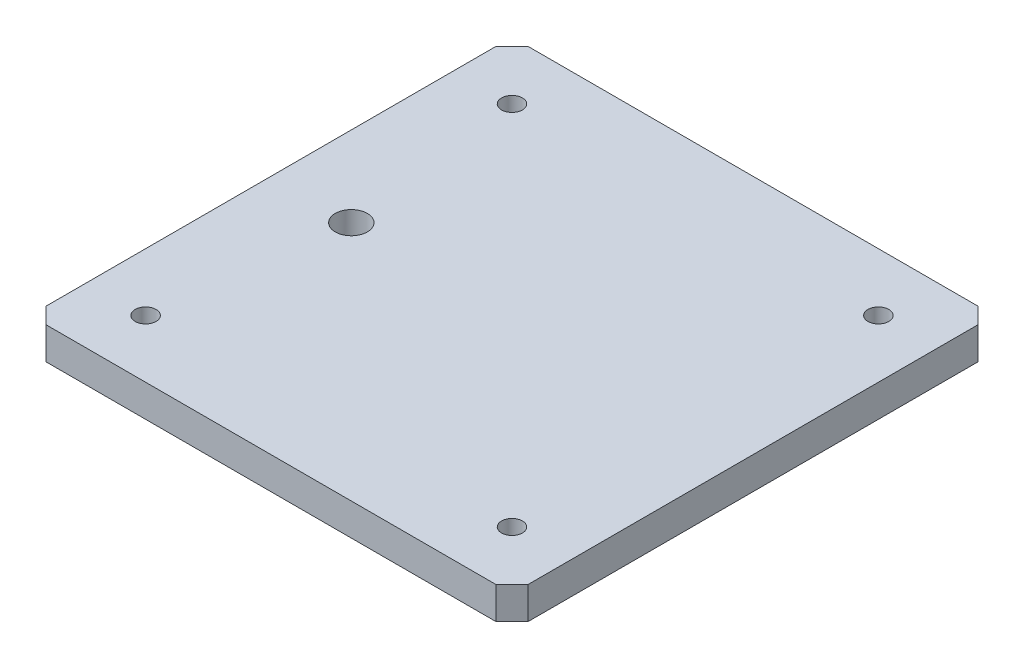
ISO-10303-21;
HEADER;
FILE_DESCRIPTION(('STEP AP214'),'2;1');
FILE_NAME('part.step','',(''),(''),'','','');
FILE_SCHEMA(('AUTOMOTIVE_DESIGN { 1 0 10303 214 1 1 1 1 }'));
ENDSEC;
DATA;
#1=APPLICATION_CONTEXT('core data for automotive mechanical design processes');
#2=APPLICATION_PROTOCOL_DEFINITION('international standard','automotive_design',2000,#1);
#3=PRODUCT_CONTEXT('',#1,'mechanical');
#4=PRODUCT('Part','Part','',(#3));
#5=PRODUCT_RELATED_PRODUCT_CATEGORY('part','',(#4));
#6=PRODUCT_DEFINITION_FORMATION('','',#4);
#7=PRODUCT_DEFINITION_CONTEXT('part definition',#1,'design');
#8=PRODUCT_DEFINITION('design','',#6,#7);
#9=PRODUCT_DEFINITION_SHAPE('','',#8);
#10=(LENGTH_UNIT() NAMED_UNIT(*) SI_UNIT(.MILLI.,.METRE.));
#11=(NAMED_UNIT(*) PLANE_ANGLE_UNIT() SI_UNIT($,.RADIAN.));
#12=(NAMED_UNIT(*) SI_UNIT($,.STERADIAN.) SOLID_ANGLE_UNIT());
#13=UNCERTAINTY_MEASURE_WITH_UNIT(LENGTH_MEASURE(1.E-05),#10,'distance_accuracy_value','');
#14=(GEOMETRIC_REPRESENTATION_CONTEXT(3) GLOBAL_UNCERTAINTY_ASSIGNED_CONTEXT((#13)) GLOBAL_UNIT_ASSIGNED_CONTEXT((#10,
#11,#12)) REPRESENTATION_CONTEXT('',''));
#15=CARTESIAN_POINT('',(0.,0.,0.));
#16=DIRECTION('',(0.,0.,1.));
#17=DIRECTION('',(1.,0.,0.));
#18=AXIS2_PLACEMENT_3D('',#15,#16,#17);
#19=CARTESIAN_POINT('',(-75.,10.,75.));
#20=DIRECTION('',(1.,0.,0.));
#21=DIRECTION('',(0.,0.,-1.));
#22=AXIS2_PLACEMENT_3D('',#19,#20,#21);
#23=PLANE('',#22);
#24=DIRECTION('',(0.,0.,1.));
#25=VECTOR('',#24,1.);
#26=CARTESIAN_POINT('',(-75.,10.,75.));
#27=LINE('',#26,#25);
#28=CARTESIAN_POINT('',(-75.,10.,-70.));
#29=VERTEX_POINT('',#28);
#30=CARTESIAN_POINT('',(-75.,10.,70.));
#31=VERTEX_POINT('',#30);
#32=EDGE_CURVE('E126',#29,#31,#27,.T.);
#33=ORIENTED_EDGE('',*,*,#32,.F.);
#34=DIRECTION('',(0.,-1.,0.));
#35=VECTOR('',#34,1.);
#36=CARTESIAN_POINT('',(-75.,10.,-70.));
#37=LINE('',#36,#35);
#38=CARTESIAN_POINT('',(-75.,0.,-70.));
#39=VERTEX_POINT('',#38);
#40=EDGE_CURVE('E11',#29,#39,#37,.T.);
#41=ORIENTED_EDGE('',*,*,#40,.T.);
#42=DIRECTION('',(0.,0.,1.));
#43=VECTOR('',#42,1.);
#44=CARTESIAN_POINT('',(-75.,0.,75.));
#45=LINE('',#44,#43);
#46=CARTESIAN_POINT('',(-75.,0.,70.));
#47=VERTEX_POINT('',#46);
#48=EDGE_CURVE('E158',#39,#47,#45,.T.);
#49=ORIENTED_EDGE('',*,*,#48,.T.);
#50=DIRECTION('',(0.,1.,0.));
#51=VECTOR('',#50,1.);
#52=CARTESIAN_POINT('',(-75.,10.,70.));
#53=LINE('',#52,#51);
#54=EDGE_CURVE('E40',#47,#31,#53,.T.);
#55=ORIENTED_EDGE('',*,*,#54,.T.);
#56=EDGE_LOOP('',(#33,#41,#49,#55));
#57=FACE_BOUND('',#56,.T.);
#58=ADVANCED_FACE('F31',(#57),#23,.F.);
#59=CARTESIAN_POINT('',(-75.,10.,75.));
#60=DIRECTION('',(0.,0.,-1.));
#61=DIRECTION('',(-1.,0.,0.));
#62=AXIS2_PLACEMENT_3D('',#59,#60,#61);
#63=PLANE('',#62);
#64=DIRECTION('',(1.,0.,0.));
#65=VECTOR('',#64,1.);
#66=CARTESIAN_POINT('',(-75.,0.,75.));
#67=LINE('',#66,#65);
#68=CARTESIAN_POINT('',(-70.,0.,75.));
#69=VERTEX_POINT('',#68);
#70=CARTESIAN_POINT('',(70.,0.,75.));
#71=VERTEX_POINT('',#70);
#72=EDGE_CURVE('E131',#69,#71,#67,.T.);
#73=ORIENTED_EDGE('',*,*,#72,.T.);
#74=DIRECTION('',(0.,1.,0.));
#75=VECTOR('',#74,1.);
#76=CARTESIAN_POINT('',(70.,10.,75.));
#77=LINE('',#76,#75);
#78=CARTESIAN_POINT('',(70.,10.,75.));
#79=VERTEX_POINT('',#78);
#80=EDGE_CURVE('E47',#71,#79,#77,.T.);
#81=ORIENTED_EDGE('',*,*,#80,.T.);
#82=DIRECTION('',(1.,0.,0.));
#83=VECTOR('',#82,1.);
#84=CARTESIAN_POINT('',(-75.,10.,75.));
#85=LINE('',#84,#83);
#86=CARTESIAN_POINT('',(-70.,10.,75.));
#87=VERTEX_POINT('',#86);
#88=EDGE_CURVE('E129',#87,#79,#85,.T.);
#89=ORIENTED_EDGE('',*,*,#88,.F.);
#90=DIRECTION('',(0.,-1.,0.));
#91=VECTOR('',#90,1.);
#92=CARTESIAN_POINT('',(-70.,10.,75.));
#93=LINE('',#92,#91);
#94=EDGE_CURVE('E149',#87,#69,#93,.T.);
#95=ORIENTED_EDGE('',*,*,#94,.T.);
#96=EDGE_LOOP('',(#73,#81,#89,#95));
#97=FACE_BOUND('',#96,.T.);
#98=ADVANCED_FACE('F165',(#97),#63,.F.);
#99=CARTESIAN_POINT('',(75.,10.,75.));
#100=DIRECTION('',(-1.,0.,0.));
#101=DIRECTION('',(0.,0.,1.));
#102=AXIS2_PLACEMENT_3D('',#99,#100,#101);
#103=PLANE('',#102);
#104=DIRECTION('',(0.,0.,-1.));
#105=VECTOR('',#104,1.);
#106=CARTESIAN_POINT('',(75.,0.,75.));
#107=LINE('',#106,#105);
#108=CARTESIAN_POINT('',(75.,0.,70.));
#109=VERTEX_POINT('',#108);
#110=CARTESIAN_POINT('',(75.,0.,-70.));
#111=VERTEX_POINT('',#110);
#112=EDGE_CURVE('E127',#109,#111,#107,.T.);
#113=ORIENTED_EDGE('',*,*,#112,.T.);
#114=DIRECTION('',(0.,1.,0.));
#115=VECTOR('',#114,1.);
#116=CARTESIAN_POINT('',(75.,10.,-70.));
#117=LINE('',#116,#115);
#118=CARTESIAN_POINT('',(75.,10.,-70.));
#119=VERTEX_POINT('',#118);
#120=EDGE_CURVE('E104',#111,#119,#117,.T.);
#121=ORIENTED_EDGE('',*,*,#120,.T.);
#122=DIRECTION('',(0.,0.,-1.));
#123=VECTOR('',#122,1.);
#124=CARTESIAN_POINT('',(75.,10.,75.));
#125=LINE('',#124,#123);
#126=CARTESIAN_POINT('',(75.,10.,70.));
#127=VERTEX_POINT('',#126);
#128=EDGE_CURVE('E170',#127,#119,#125,.T.);
#129=ORIENTED_EDGE('',*,*,#128,.F.);
#130=DIRECTION('',(0.,-1.,0.));
#131=VECTOR('',#130,1.);
#132=CARTESIAN_POINT('',(75.,10.,70.));
#133=LINE('',#132,#131);
#134=EDGE_CURVE('E109',#127,#109,#133,.T.);
#135=ORIENTED_EDGE('',*,*,#134,.T.);
#136=EDGE_LOOP('',(#113,#121,#129,#135));
#137=FACE_BOUND('',#136,.T.);
#138=ADVANCED_FACE('F229',(#137),#103,.F.);
#139=CARTESIAN_POINT('',(-75.,10.,-75.));
#140=DIRECTION('',(0.,0.,1.));
#141=DIRECTION('',(1.,0.,0.));
#142=AXIS2_PLACEMENT_3D('',#139,#140,#141);
#143=PLANE('',#142);
#144=DIRECTION('',(-1.,0.,0.));
#145=VECTOR('',#144,1.);
#146=CARTESIAN_POINT('',(-75.,10.,-75.));
#147=LINE('',#146,#145);
#148=CARTESIAN_POINT('',(70.,10.,-75.));
#149=VERTEX_POINT('',#148);
#150=CARTESIAN_POINT('',(-70.,10.,-75.));
#151=VERTEX_POINT('',#150);
#152=EDGE_CURVE('E119',#149,#151,#147,.T.);
#153=ORIENTED_EDGE('',*,*,#152,.F.);
#154=DIRECTION('',(0.,-1.,0.));
#155=VECTOR('',#154,1.);
#156=CARTESIAN_POINT('',(70.,10.,-75.));
#157=LINE('',#156,#155);
#158=CARTESIAN_POINT('',(70.,0.,-75.));
#159=VERTEX_POINT('',#158);
#160=EDGE_CURVE('E103',#149,#159,#157,.T.);
#161=ORIENTED_EDGE('',*,*,#160,.T.);
#162=DIRECTION('',(-1.,0.,0.));
#163=VECTOR('',#162,1.);
#164=CARTESIAN_POINT('',(-75.,0.,-75.));
#165=LINE('',#164,#163);
#166=CARTESIAN_POINT('',(-70.,0.,-75.));
#167=VERTEX_POINT('',#166);
#168=EDGE_CURVE('E116',#159,#167,#165,.T.);
#169=ORIENTED_EDGE('',*,*,#168,.T.);
#170=DIRECTION('',(0.,1.,0.));
#171=VECTOR('',#170,1.);
#172=CARTESIAN_POINT('',(-70.,10.,-75.));
#173=LINE('',#172,#171);
#174=EDGE_CURVE('E121',#167,#151,#173,.T.);
#175=ORIENTED_EDGE('',*,*,#174,.T.);
#176=EDGE_LOOP('',(#153,#161,#169,#175));
#177=FACE_BOUND('',#176,.T.);
#178=ADVANCED_FACE('F115',(#177),#143,.F.);
#179=CARTESIAN_POINT('',(-75.,10.,-75.));
#180=DIRECTION('',(0.,-1.,0.));
#181=DIRECTION('',(0.,0.,-1.));
#182=AXIS2_PLACEMENT_3D('',#179,#180,#181);
#183=PLANE('',#182);
#184=CARTESIAN_POINT('',(-50.,10.,0.));
#185=DIRECTION('',(0.,1.,0.));
#186=DIRECTION('',(0.,0.,1.));
#187=AXIS2_PLACEMENT_3D('',#184,#185,#186);
#188=CIRCLE('',#187,5.);
#189=CARTESIAN_POINT('',(-50.,10.,5.));
#190=VERTEX_POINT('',#189);
#191=EDGE_CURVE('E196',#190,#190,#188,.T.);
#192=ORIENTED_EDGE('',*,*,#191,.F.);
#193=EDGE_LOOP('',(#192));
#194=FACE_BOUND('',#193,.T.);
#195=CARTESIAN_POINT('',(-57.,10.,-57.));
#196=DIRECTION('',(0.,1.,0.));
#197=DIRECTION('',(0.,0.,1.));
#198=AXIS2_PLACEMENT_3D('',#195,#196,#197);
#199=CIRCLE('',#198,3.24999999999999);
#200=CARTESIAN_POINT('',(-57.,10.,-53.75));
#201=VERTEX_POINT('',#200);
#202=EDGE_CURVE('E193',#201,#201,#199,.T.);
#203=ORIENTED_EDGE('',*,*,#202,.F.);
#204=EDGE_LOOP('',(#203));
#205=FACE_BOUND('',#204,.T.);
#206=CARTESIAN_POINT('',(57.,10.,-57.));
#207=DIRECTION('',(0.,1.,0.));
#208=DIRECTION('',(0.,0.,1.));
#209=AXIS2_PLACEMENT_3D('',#206,#207,#208);
#210=CIRCLE('',#209,3.24999999999999);
#211=CARTESIAN_POINT('',(57.,10.,-53.75));
#212=VERTEX_POINT('',#211);
#213=EDGE_CURVE('E187',#212,#212,#210,.T.);
#214=ORIENTED_EDGE('',*,*,#213,.F.);
#215=EDGE_LOOP('',(#214));
#216=FACE_BOUND('',#215,.T.);
#217=CARTESIAN_POINT('',(-57.,10.,57.));
#218=DIRECTION('',(0.,1.,0.));
#219=DIRECTION('',(0.,0.,1.));
#220=AXIS2_PLACEMENT_3D('',#217,#218,#219);
#221=CIRCLE('',#220,3.24999999999999);
#222=CARTESIAN_POINT('',(-57.,10.,60.25));
#223=VERTEX_POINT('',#222);
#224=EDGE_CURVE('E181',#223,#223,#221,.T.);
#225=ORIENTED_EDGE('',*,*,#224,.F.);
#226=EDGE_LOOP('',(#225));
#227=FACE_BOUND('',#226,.T.);
#228=CARTESIAN_POINT('',(57.,10.,57.));
#229=DIRECTION('',(0.,1.,0.));
#230=DIRECTION('',(0.,0.,1.));
#231=AXIS2_PLACEMENT_3D('',#228,#229,#230);
#232=CIRCLE('',#231,3.24999999999999);
#233=CARTESIAN_POINT('',(57.,10.,60.25));
#234=VERTEX_POINT('',#233);
#235=EDGE_CURVE('E175',#234,#234,#232,.T.);
#236=ORIENTED_EDGE('',*,*,#235,.F.);
#237=EDGE_LOOP('',(#236));
#238=FACE_BOUND('',#237,.T.);
#239=ORIENTED_EDGE('',*,*,#128,.T.);
#240=DIRECTION('',(0.707106781186546,0.,0.707106781186549));
#241=VECTOR('',#240,1.);
#242=CARTESIAN_POINT('',(70.,10.,-75.));
#243=LINE('',#242,#241);
#244=EDGE_CURVE('E147',#119,#149,#243,.F.);
#245=ORIENTED_EDGE('',*,*,#244,.T.);
#246=ORIENTED_EDGE('',*,*,#152,.T.);
#247=DIRECTION('',(0.707106781186549,0.,-0.707106781186546));
#248=VECTOR('',#247,1.);
#249=CARTESIAN_POINT('',(-75.,10.,-70.));
#250=LINE('',#249,#248);
#251=EDGE_CURVE('E143',#151,#29,#250,.F.);
#252=ORIENTED_EDGE('',*,*,#251,.T.);
#253=ORIENTED_EDGE('',*,*,#32,.T.);
#254=DIRECTION('',(-0.707106781186546,0.,-0.707106781186549));
#255=VECTOR('',#254,1.);
#256=CARTESIAN_POINT('',(-70.,10.,75.));
#257=LINE('',#256,#255);
#258=EDGE_CURVE('E54',#31,#87,#257,.F.);
#259=ORIENTED_EDGE('',*,*,#258,.T.);
#260=ORIENTED_EDGE('',*,*,#88,.T.);
#261=DIRECTION('',(-0.707106781186549,0.,0.707106781186546));
#262=VECTOR('',#261,1.);
#263=CARTESIAN_POINT('',(75.,10.,70.));
#264=LINE('',#263,#262);
#265=EDGE_CURVE('E145',#79,#127,#264,.F.);
#266=ORIENTED_EDGE('',*,*,#265,.T.);
#267=EDGE_LOOP('',(#239,#245,#246,#252,#253,#259,#260,#266));
#268=FACE_BOUND('',#267,.T.);
#269=ADVANCED_FACE('F161',(#194,#205,#216,#227,#238,#268),#183,.F.);
#270=CARTESIAN_POINT('',(-75.,0.,-75.));
#271=DIRECTION('',(0.,-1.,0.));
#272=DIRECTION('',(0.,0.,-1.));
#273=AXIS2_PLACEMENT_3D('',#270,#271,#272);
#274=PLANE('',#273);
#275=CARTESIAN_POINT('',(-50.,0.,0.));
#276=DIRECTION('',(0.,-1.,0.));
#277=DIRECTION('',(0.,0.,-1.));
#278=AXIS2_PLACEMENT_3D('',#275,#276,#277);
#279=CIRCLE('',#278,5.);
#280=CARTESIAN_POINT('',(-50.,0.,-5.));
#281=VERTEX_POINT('',#280);
#282=EDGE_CURVE('E35',#281,#281,#279,.T.);
#283=ORIENTED_EDGE('',*,*,#282,.F.);
#284=EDGE_LOOP('',(#283));
#285=FACE_BOUND('',#284,.T.);
#286=CARTESIAN_POINT('',(-57.,0.,-57.));
#287=DIRECTION('',(0.,1.,0.));
#288=DIRECTION('',(0.,0.,1.));
#289=AXIS2_PLACEMENT_3D('',#286,#287,#288);
#290=CIRCLE('',#289,3.25);
#291=CARTESIAN_POINT('',(-57.,0.,-53.75));
#292=VERTEX_POINT('',#291);
#293=EDGE_CURVE('E190',#292,#292,#290,.T.);
#294=ORIENTED_EDGE('',*,*,#293,.T.);
#295=EDGE_LOOP('',(#294));
#296=FACE_BOUND('',#295,.T.);
#297=CARTESIAN_POINT('',(57.,0.,-57.));
#298=DIRECTION('',(0.,1.,0.));
#299=DIRECTION('',(0.,0.,1.));
#300=AXIS2_PLACEMENT_3D('',#297,#298,#299);
#301=CIRCLE('',#300,3.25);
#302=CARTESIAN_POINT('',(57.,0.,-53.75));
#303=VERTEX_POINT('',#302);
#304=EDGE_CURVE('E184',#303,#303,#301,.T.);
#305=ORIENTED_EDGE('',*,*,#304,.T.);
#306=EDGE_LOOP('',(#305));
#307=FACE_BOUND('',#306,.T.);
#308=CARTESIAN_POINT('',(-57.,0.,57.));
#309=DIRECTION('',(0.,1.,0.));
#310=DIRECTION('',(0.,0.,1.));
#311=AXIS2_PLACEMENT_3D('',#308,#309,#310);
#312=CIRCLE('',#311,3.25);
#313=CARTESIAN_POINT('',(-57.,0.,60.25));
#314=VERTEX_POINT('',#313);
#315=EDGE_CURVE('E178',#314,#314,#312,.T.);
#316=ORIENTED_EDGE('',*,*,#315,.T.);
#317=EDGE_LOOP('',(#316));
#318=FACE_BOUND('',#317,.T.);
#319=CARTESIAN_POINT('',(57.,0.,57.));
#320=DIRECTION('',(0.,1.,0.));
#321=DIRECTION('',(0.,0.,1.));
#322=AXIS2_PLACEMENT_3D('',#319,#320,#321);
#323=CIRCLE('',#322,3.25);
#324=CARTESIAN_POINT('',(57.,0.,60.25));
#325=VERTEX_POINT('',#324);
#326=EDGE_CURVE('E166',#325,#325,#323,.T.);
#327=ORIENTED_EDGE('',*,*,#326,.T.);
#328=EDGE_LOOP('',(#327));
#329=FACE_BOUND('',#328,.T.);
#330=ORIENTED_EDGE('',*,*,#168,.F.);
#331=DIRECTION('',(-0.707106781186546,0.,-0.707106781186549));
#332=VECTOR('',#331,1.);
#333=CARTESIAN_POINT('',(-2.4999999999996,0.,-147.5));
#334=LINE('',#333,#332);
#335=EDGE_CURVE('E99',#159,#111,#334,.F.);
#336=ORIENTED_EDGE('',*,*,#335,.T.);
#337=ORIENTED_EDGE('',*,*,#112,.F.);
#338=DIRECTION('',(0.707106781186549,0.,-0.707106781186546));
#339=VECTOR('',#338,1.);
#340=CARTESIAN_POINT('',(72.4999999999996,0.,72.5000000000004));
#341=LINE('',#340,#339);
#342=EDGE_CURVE('E110',#109,#71,#341,.F.);
#343=ORIENTED_EDGE('',*,*,#342,.T.);
#344=ORIENTED_EDGE('',*,*,#72,.F.);
#345=DIRECTION('',(0.707106781186546,0.,0.707106781186549));
#346=VECTOR('',#345,1.);
#347=CARTESIAN_POINT('',(-147.5,0.,-2.50000000000039));
#348=LINE('',#347,#346);
#349=EDGE_CURVE('E120',#69,#47,#348,.F.);
#350=ORIENTED_EDGE('',*,*,#349,.T.);
#351=ORIENTED_EDGE('',*,*,#48,.F.);
#352=DIRECTION('',(-0.707106781186549,0.,0.707106781186546));
#353=VECTOR('',#352,1.);
#354=CARTESIAN_POINT('',(-72.5,0.,-72.5));
#355=LINE('',#354,#353);
#356=EDGE_CURVE('E125',#39,#167,#355,.F.);
#357=ORIENTED_EDGE('',*,*,#356,.T.);
#358=EDGE_LOOP('',(#330,#336,#337,#343,#344,#350,#351,#357));
#359=FACE_BOUND('',#358,.T.);
#360=ADVANCED_FACE('F123',(#285,#296,#307,#318,#329,#359),#274,.T.);
#361=CARTESIAN_POINT('',(70.,10.,-75.));
#362=DIRECTION('',(-0.707106781186549,0.,0.707106781186545));
#363=DIRECTION('',(0.707106781186546,0.,0.707106781186549));
#364=AXIS2_PLACEMENT_3D('',#361,#362,#363);
#365=PLANE('',#364);
#366=ORIENTED_EDGE('',*,*,#244,.F.);
#367=ORIENTED_EDGE('',*,*,#120,.F.);
#368=ORIENTED_EDGE('',*,*,#335,.F.);
#369=ORIENTED_EDGE('',*,*,#160,.F.);
#370=EDGE_LOOP('',(#366,#367,#368,#369));
#371=FACE_BOUND('',#370,.T.);
#372=ADVANCED_FACE('F102',(#371),#365,.F.);
#373=CARTESIAN_POINT('',(75.,10.,70.));
#374=DIRECTION('',(-0.707106781186545,0.,-0.707106781186549));
#375=DIRECTION('',(-0.707106781186549,0.,0.707106781186546));
#376=AXIS2_PLACEMENT_3D('',#373,#374,#375);
#377=PLANE('',#376);
#378=ORIENTED_EDGE('',*,*,#265,.F.);
#379=ORIENTED_EDGE('',*,*,#80,.F.);
#380=ORIENTED_EDGE('',*,*,#342,.F.);
#381=ORIENTED_EDGE('',*,*,#134,.F.);
#382=EDGE_LOOP('',(#378,#379,#380,#381));
#383=FACE_BOUND('',#382,.T.);
#384=ADVANCED_FACE('F242',(#383),#377,.F.);
#385=CARTESIAN_POINT('',(-75.,10.,-70.));
#386=DIRECTION('',(0.707106781186546,0.,0.707106781186549));
#387=DIRECTION('',(0.707106781186549,0.,-0.707106781186546));
#388=AXIS2_PLACEMENT_3D('',#385,#386,#387);
#389=PLANE('',#388);
#390=ORIENTED_EDGE('',*,*,#251,.F.);
#391=ORIENTED_EDGE('',*,*,#174,.F.);
#392=ORIENTED_EDGE('',*,*,#356,.F.);
#393=ORIENTED_EDGE('',*,*,#40,.F.);
#394=EDGE_LOOP('',(#390,#391,#392,#393));
#395=FACE_BOUND('',#394,.T.);
#396=ADVANCED_FACE('F244',(#395),#389,.F.);
#397=CARTESIAN_POINT('',(-70.,10.,75.));
#398=DIRECTION('',(0.707106781186549,0.,-0.707106781186545));
#399=DIRECTION('',(-0.707106781186546,0.,-0.707106781186549));
#400=AXIS2_PLACEMENT_3D('',#397,#398,#399);
#401=PLANE('',#400);
#402=ORIENTED_EDGE('',*,*,#258,.F.);
#403=ORIENTED_EDGE('',*,*,#54,.F.);
#404=ORIENTED_EDGE('',*,*,#349,.F.);
#405=ORIENTED_EDGE('',*,*,#94,.F.);
#406=EDGE_LOOP('',(#402,#403,#404,#405));
#407=FACE_BOUND('',#406,.T.);
#408=ADVANCED_FACE('F33',(#407),#401,.F.);
#409=CARTESIAN_POINT('',(57.,10.,57.));
#410=DIRECTION('',(0.,1.,0.));
#411=DIRECTION('',(0.,0.,1.));
#412=AXIS2_PLACEMENT_3D('',#409,#410,#411);
#413=CYLINDRICAL_SURFACE('',#412,3.24999999999999);
#414=ORIENTED_EDGE('',*,*,#326,.F.);
#415=EDGE_LOOP('',(#414));
#416=FACE_BOUND('',#415,.T.);
#417=ORIENTED_EDGE('',*,*,#235,.T.);
#418=EDGE_LOOP('',(#417));
#419=FACE_BOUND('',#418,.T.);
#420=ADVANCED_FACE('F216',(#416,#419),#413,.F.);
#421=CARTESIAN_POINT('',(-57.,10.,57.));
#422=DIRECTION('',(0.,1.,0.));
#423=DIRECTION('',(0.,0.,1.));
#424=AXIS2_PLACEMENT_3D('',#421,#422,#423);
#425=CYLINDRICAL_SURFACE('',#424,3.24999999999999);
#426=ORIENTED_EDGE('',*,*,#315,.F.);
#427=EDGE_LOOP('',(#426));
#428=FACE_BOUND('',#427,.T.);
#429=ORIENTED_EDGE('',*,*,#224,.T.);
#430=EDGE_LOOP('',(#429));
#431=FACE_BOUND('',#430,.T.);
#432=ADVANCED_FACE('F219',(#428,#431),#425,.F.);
#433=CARTESIAN_POINT('',(57.,10.,-57.));
#434=DIRECTION('',(0.,1.,0.));
#435=DIRECTION('',(0.,0.,1.));
#436=AXIS2_PLACEMENT_3D('',#433,#434,#435);
#437=CYLINDRICAL_SURFACE('',#436,3.24999999999999);
#438=ORIENTED_EDGE('',*,*,#304,.F.);
#439=EDGE_LOOP('',(#438));
#440=FACE_BOUND('',#439,.T.);
#441=ORIENTED_EDGE('',*,*,#213,.T.);
#442=EDGE_LOOP('',(#441));
#443=FACE_BOUND('',#442,.T.);
#444=ADVANCED_FACE('F303',(#440,#443),#437,.F.);
#445=CARTESIAN_POINT('',(-57.,10.,-57.));
#446=DIRECTION('',(0.,1.,0.));
#447=DIRECTION('',(0.,0.,1.));
#448=AXIS2_PLACEMENT_3D('',#445,#446,#447);
#449=CYLINDRICAL_SURFACE('',#448,3.24999999999999);
#450=ORIENTED_EDGE('',*,*,#293,.F.);
#451=EDGE_LOOP('',(#450));
#452=FACE_BOUND('',#451,.T.);
#453=ORIENTED_EDGE('',*,*,#202,.T.);
#454=EDGE_LOOP('',(#453));
#455=FACE_BOUND('',#454,.T.);
#456=ADVANCED_FACE('F313',(#452,#455),#449,.F.);
#457=CARTESIAN_POINT('',(-50.,-5.,0.));
#458=DIRECTION('',(0.,1.,0.));
#459=DIRECTION('',(0.,0.,1.));
#460=AXIS2_PLACEMENT_3D('',#457,#458,#459);
#461=CYLINDRICAL_SURFACE('',#460,5.);
#462=ORIENTED_EDGE('',*,*,#282,.T.);
#463=EDGE_LOOP('',(#462));
#464=FACE_BOUND('',#463,.T.);
#465=ORIENTED_EDGE('',*,*,#191,.T.);
#466=EDGE_LOOP('',(#465));
#467=FACE_BOUND('',#466,.T.);
#468=ADVANCED_FACE('F203',(#464,#467),#461,.F.);
#469=CLOSED_SHELL('',(#58,#98,#138,#178,#269,#360,#372,#384,#396,#408,#420,#432,#444,#456,#468));
#470=MANIFOLD_SOLID_BREP('B2',#469);
#471=ADVANCED_BREP_SHAPE_REPRESENTATION('',(#18,#470),#14);
#472=SHAPE_DEFINITION_REPRESENTATION(#9,#471);
ENDSEC;
END-ISO-10303-21;
